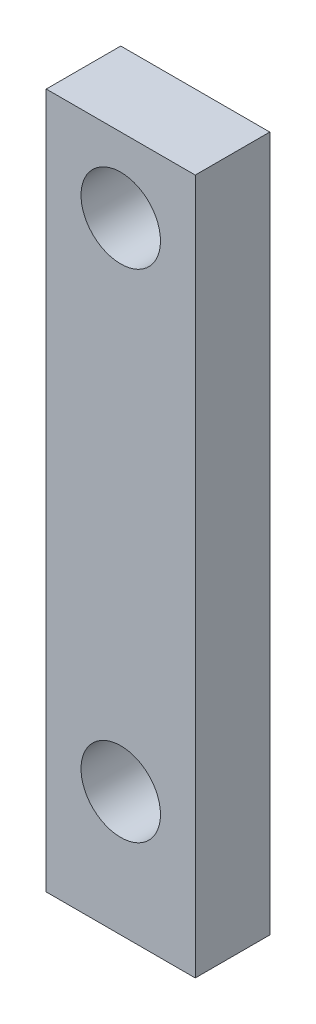
ISO-10303-21;
HEADER;
FILE_DESCRIPTION(('STEP AP214'),'2;1');
FILE_NAME('part.step','',(''),(''),'','','');
FILE_SCHEMA(('AUTOMOTIVE_DESIGN { 1 0 10303 214 1 1 1 1 }'));
ENDSEC;
DATA;
#1=APPLICATION_CONTEXT('core data for automotive mechanical design processes');
#2=APPLICATION_PROTOCOL_DEFINITION('international standard','automotive_design',2000,#1);
#3=PRODUCT_CONTEXT('',#1,'mechanical');
#4=PRODUCT('Part','Part','',(#3));
#5=PRODUCT_RELATED_PRODUCT_CATEGORY('part','',(#4));
#6=PRODUCT_DEFINITION_FORMATION('','',#4);
#7=PRODUCT_DEFINITION_CONTEXT('part definition',#1,'design');
#8=PRODUCT_DEFINITION('design','',#6,#7);
#9=PRODUCT_DEFINITION_SHAPE('','',#8);
#10=(LENGTH_UNIT() NAMED_UNIT(*) SI_UNIT(.MILLI.,.METRE.));
#11=(NAMED_UNIT(*) PLANE_ANGLE_UNIT() SI_UNIT($,.RADIAN.));
#12=(NAMED_UNIT(*) SI_UNIT($,.STERADIAN.) SOLID_ANGLE_UNIT());
#13=UNCERTAINTY_MEASURE_WITH_UNIT(LENGTH_MEASURE(1.E-05),#10,'distance_accuracy_value','');
#14=(GEOMETRIC_REPRESENTATION_CONTEXT(3) GLOBAL_UNCERTAINTY_ASSIGNED_CONTEXT((#13)) GLOBAL_UNIT_ASSIGNED_CONTEXT((#10,
#11,#12)) REPRESENTATION_CONTEXT('',''));
#15=CARTESIAN_POINT('',(0.,0.,0.));
#16=DIRECTION('',(0.,0.,1.));
#17=DIRECTION('',(1.,0.,0.));
#18=AXIS2_PLACEMENT_3D('',#15,#16,#17);
#19=CARTESIAN_POINT('',(0.,0.,3.));
#20=DIRECTION('',(0.,0.,1.));
#21=DIRECTION('',(1.,0.,0.));
#22=AXIS2_PLACEMENT_3D('',#19,#20,#21);
#23=PLANE('',#22);
#24=CARTESIAN_POINT('',(-7.52428779759909,59.3000000000002,3.));
#25=DIRECTION('',(0.,0.,1.));
#26=DIRECTION('',(1.,0.,0.));
#27=AXIS2_PLACEMENT_3D('',#24,#25,#26);
#28=CIRCLE('',#27,1.6);
#29=CARTESIAN_POINT('',(-5.92428779759909,59.3000000000002,3.));
#30=VERTEX_POINT('',#29);
#31=EDGE_CURVE('E99',#30,#30,#28,.T.);
#32=ORIENTED_EDGE('',*,*,#31,.F.);
#33=EDGE_LOOP('',(#32));
#34=FACE_BOUND('',#33,.T.);
#35=DIRECTION('',(0.,1.,0.));
#36=VECTOR('',#35,1.);
#37=CARTESIAN_POINT('',(-4.52428779759909,54.3000000000002,3.));
#38=LINE('',#37,#36);
#39=CARTESIAN_POINT('',(-4.52428779759909,54.3000000000002,3.));
#40=VERTEX_POINT('',#39);
#41=CARTESIAN_POINT('',(-4.52428779759909,82.3000000000003,3.));
#42=VERTEX_POINT('',#41);
#43=EDGE_CURVE('E84',#40,#42,#38,.T.);
#44=ORIENTED_EDGE('',*,*,#43,.T.);
#45=DIRECTION('',(-1.,0.,0.));
#46=VECTOR('',#45,1.);
#47=CARTESIAN_POINT('',(-4.52428779759909,82.3000000000003,3.));
#48=LINE('',#47,#46);
#49=CARTESIAN_POINT('',(-10.5242877975991,82.3000000000003,3.));
#50=VERTEX_POINT('',#49);
#51=EDGE_CURVE('E79',#42,#50,#48,.T.);
#52=ORIENTED_EDGE('',*,*,#51,.T.);
#53=DIRECTION('',(0.,-1.,0.));
#54=VECTOR('',#53,1.);
#55=CARTESIAN_POINT('',(-10.5242877975991,54.3000000000002,3.));
#56=LINE('',#55,#54);
#57=CARTESIAN_POINT('',(-10.5242877975991,54.3000000000002,3.));
#58=VERTEX_POINT('',#57);
#59=EDGE_CURVE('E82',#50,#58,#56,.T.);
#60=ORIENTED_EDGE('',*,*,#59,.T.);
#61=DIRECTION('',(1.,0.,0.));
#62=VECTOR('',#61,1.);
#63=CARTESIAN_POINT('',(-4.52428779759909,54.3000000000002,3.));
#64=LINE('',#63,#62);
#65=EDGE_CURVE('E49',#58,#40,#64,.T.);
#66=ORIENTED_EDGE('',*,*,#65,.T.);
#67=EDGE_LOOP('',(#44,#52,#60,#66));
#68=FACE_BOUND('',#67,.T.);
#69=CARTESIAN_POINT('',(-7.52428779759909,79.3000000000002,3.));
#70=DIRECTION('',(0.,0.,1.));
#71=DIRECTION('',(1.,0.,0.));
#72=AXIS2_PLACEMENT_3D('',#69,#70,#71);
#73=CIRCLE('',#72,1.60000000000001);
#74=CARTESIAN_POINT('',(-5.92428779759909,79.3000000000002,3.));
#75=VERTEX_POINT('',#74);
#76=EDGE_CURVE('E114',#75,#75,#73,.T.);
#77=ORIENTED_EDGE('',*,*,#76,.F.);
#78=EDGE_LOOP('',(#77));
#79=FACE_BOUND('',#78,.T.);
#80=ADVANCED_FACE('F32',(#34,#68,#79),#23,.T.);
#81=CARTESIAN_POINT('',(0.,0.,0.));
#82=DIRECTION('',(0.,0.,1.));
#83=DIRECTION('',(1.,0.,0.));
#84=AXIS2_PLACEMENT_3D('',#81,#82,#83);
#85=PLANE('',#84);
#86=DIRECTION('',(0.,1.,0.));
#87=VECTOR('',#86,1.);
#88=CARTESIAN_POINT('',(-4.52428779759909,54.3000000000002,0.));
#89=LINE('',#88,#87);
#90=CARTESIAN_POINT('',(-4.52428779759909,54.3000000000002,0.));
#91=VERTEX_POINT('',#90);
#92=CARTESIAN_POINT('',(-4.52428779759909,82.3000000000003,0.));
#93=VERTEX_POINT('',#92);
#94=EDGE_CURVE('E96',#91,#93,#89,.T.);
#95=ORIENTED_EDGE('',*,*,#94,.F.);
#96=DIRECTION('',(1.,0.,0.));
#97=VECTOR('',#96,1.);
#98=CARTESIAN_POINT('',(-4.52428779759909,54.3000000000002,0.));
#99=LINE('',#98,#97);
#100=CARTESIAN_POINT('',(-10.5242877975991,54.3000000000002,0.));
#101=VERTEX_POINT('',#100);
#102=EDGE_CURVE('E72',#101,#91,#99,.T.);
#103=ORIENTED_EDGE('',*,*,#102,.F.);
#104=DIRECTION('',(0.,-1.,0.));
#105=VECTOR('',#104,1.);
#106=CARTESIAN_POINT('',(-10.5242877975991,54.3000000000002,0.));
#107=LINE('',#106,#105);
#108=CARTESIAN_POINT('',(-10.5242877975991,82.3000000000003,0.));
#109=VERTEX_POINT('',#108);
#110=EDGE_CURVE('E66',#109,#101,#107,.T.);
#111=ORIENTED_EDGE('',*,*,#110,.F.);
#112=DIRECTION('',(-1.,0.,0.));
#113=VECTOR('',#112,1.);
#114=CARTESIAN_POINT('',(-4.52428779759909,82.3000000000003,0.));
#115=LINE('',#114,#113);
#116=EDGE_CURVE('E88',#93,#109,#115,.T.);
#117=ORIENTED_EDGE('',*,*,#116,.F.);
#118=EDGE_LOOP('',(#95,#103,#111,#117));
#119=FACE_BOUND('',#118,.T.);
#120=CARTESIAN_POINT('',(-7.52428779759909,59.3000000000002,0.));
#121=DIRECTION('',(0.,0.,1.));
#122=DIRECTION('',(1.,0.,0.));
#123=AXIS2_PLACEMENT_3D('',#120,#121,#122);
#124=CIRCLE('',#123,1.6);
#125=CARTESIAN_POINT('',(-5.92428779759909,59.3000000000002,0.));
#126=VERTEX_POINT('',#125);
#127=EDGE_CURVE('E111',#126,#126,#124,.T.);
#128=ORIENTED_EDGE('',*,*,#127,.T.);
#129=EDGE_LOOP('',(#128));
#130=FACE_BOUND('',#129,.T.);
#131=CARTESIAN_POINT('',(-7.52428779759909,79.3000000000002,0.));
#132=DIRECTION('',(0.,0.,1.));
#133=DIRECTION('',(1.,0.,0.));
#134=AXIS2_PLACEMENT_3D('',#131,#132,#133);
#135=CIRCLE('',#134,1.60000000000001);
#136=CARTESIAN_POINT('',(-5.92428779759909,79.3000000000002,0.));
#137=VERTEX_POINT('',#136);
#138=EDGE_CURVE('E117',#137,#137,#135,.T.);
#139=ORIENTED_EDGE('',*,*,#138,.T.);
#140=EDGE_LOOP('',(#139));
#141=FACE_BOUND('',#140,.T.);
#142=ADVANCED_FACE('F107',(#119,#130,#141),#85,.F.);
#143=CARTESIAN_POINT('',(-4.52428779759909,54.3000000000002,3.));
#144=DIRECTION('',(-1.,0.,0.));
#145=DIRECTION('',(0.,0.,1.));
#146=AXIS2_PLACEMENT_3D('',#143,#144,#145);
#147=PLANE('',#146);
#148=ORIENTED_EDGE('',*,*,#94,.T.);
#149=DIRECTION('',(0.,0.,-1.));
#150=VECTOR('',#149,1.);
#151=CARTESIAN_POINT('',(-4.52428779759909,82.3000000000003,3.));
#152=LINE('',#151,#150);
#153=EDGE_CURVE('E11',#42,#93,#152,.T.);
#154=ORIENTED_EDGE('',*,*,#153,.F.);
#155=ORIENTED_EDGE('',*,*,#43,.F.);
#156=DIRECTION('',(0.,0.,-1.));
#157=VECTOR('',#156,1.);
#158=CARTESIAN_POINT('',(-4.52428779759909,54.3000000000002,3.));
#159=LINE('',#158,#157);
#160=EDGE_CURVE('E92',#40,#91,#159,.T.);
#161=ORIENTED_EDGE('',*,*,#160,.T.);
#162=EDGE_LOOP('',(#148,#154,#155,#161));
#163=FACE_BOUND('',#162,.T.);
#164=ADVANCED_FACE('F34',(#163),#147,.F.);
#165=CARTESIAN_POINT('',(-4.52428779759909,82.3000000000003,3.));
#166=DIRECTION('',(0.,-1.,0.));
#167=DIRECTION('',(0.,0.,-1.));
#168=AXIS2_PLACEMENT_3D('',#165,#166,#167);
#169=PLANE('',#168);
#170=ORIENTED_EDGE('',*,*,#116,.T.);
#171=DIRECTION('',(0.,0.,-1.));
#172=VECTOR('',#171,1.);
#173=CARTESIAN_POINT('',(-10.5242877975991,82.3000000000003,3.));
#174=LINE('',#173,#172);
#175=EDGE_CURVE('E41',#50,#109,#174,.T.);
#176=ORIENTED_EDGE('',*,*,#175,.F.);
#177=ORIENTED_EDGE('',*,*,#51,.F.);
#178=ORIENTED_EDGE('',*,*,#153,.T.);
#179=EDGE_LOOP('',(#170,#176,#177,#178));
#180=FACE_BOUND('',#179,.T.);
#181=ADVANCED_FACE('F87',(#180),#169,.F.);
#182=CARTESIAN_POINT('',(-10.5242877975991,54.3000000000002,3.));
#183=DIRECTION('',(1.,0.,0.));
#184=DIRECTION('',(0.,0.,-1.));
#185=AXIS2_PLACEMENT_3D('',#182,#183,#184);
#186=PLANE('',#185);
#187=ORIENTED_EDGE('',*,*,#110,.T.);
#188=DIRECTION('',(0.,0.,-1.));
#189=VECTOR('',#188,1.);
#190=CARTESIAN_POINT('',(-10.5242877975991,54.3000000000002,3.));
#191=LINE('',#190,#189);
#192=EDGE_CURVE('E89',#58,#101,#191,.T.);
#193=ORIENTED_EDGE('',*,*,#192,.F.);
#194=ORIENTED_EDGE('',*,*,#59,.F.);
#195=ORIENTED_EDGE('',*,*,#175,.T.);
#196=EDGE_LOOP('',(#187,#193,#194,#195));
#197=FACE_BOUND('',#196,.T.);
#198=ADVANCED_FACE('F90',(#197),#186,.F.);
#199=CARTESIAN_POINT('',(-4.52428779759909,54.3000000000002,3.));
#200=DIRECTION('',(0.,1.,0.));
#201=DIRECTION('',(0.,0.,1.));
#202=AXIS2_PLACEMENT_3D('',#199,#200,#201);
#203=PLANE('',#202);
#204=ORIENTED_EDGE('',*,*,#102,.T.);
#205=ORIENTED_EDGE('',*,*,#160,.F.);
#206=ORIENTED_EDGE('',*,*,#65,.F.);
#207=ORIENTED_EDGE('',*,*,#192,.T.);
#208=EDGE_LOOP('',(#204,#205,#206,#207));
#209=FACE_BOUND('',#208,.T.);
#210=ADVANCED_FACE('F104',(#209),#203,.F.);
#211=CARTESIAN_POINT('',(-7.52428779759909,59.3000000000002,3.));
#212=DIRECTION('',(0.,0.,-1.));
#213=DIRECTION('',(-1.,0.,0.));
#214=AXIS2_PLACEMENT_3D('',#211,#212,#213);
#215=CYLINDRICAL_SURFACE('',#214,1.6);
#216=ORIENTED_EDGE('',*,*,#31,.T.);
#217=EDGE_LOOP('',(#216));
#218=FACE_BOUND('',#217,.T.);
#219=ORIENTED_EDGE('',*,*,#127,.F.);
#220=EDGE_LOOP('',(#219));
#221=FACE_BOUND('',#220,.T.);
#222=ADVANCED_FACE('F134',(#218,#221),#215,.F.);
#223=CARTESIAN_POINT('',(-7.52428779759909,79.3000000000002,3.));
#224=DIRECTION('',(0.,0.,-1.));
#225=DIRECTION('',(-1.,0.,0.));
#226=AXIS2_PLACEMENT_3D('',#223,#224,#225);
#227=CYLINDRICAL_SURFACE('',#226,1.60000000000001);
#228=ORIENTED_EDGE('',*,*,#76,.T.);
#229=EDGE_LOOP('',(#228));
#230=FACE_BOUND('',#229,.T.);
#231=ORIENTED_EDGE('',*,*,#138,.F.);
#232=EDGE_LOOP('',(#231));
#233=FACE_BOUND('',#232,.T.);
#234=ADVANCED_FACE('F123',(#230,#233),#227,.F.);
#235=CLOSED_SHELL('',(#80,#142,#164,#181,#198,#210,#222,#234));
#236=MANIFOLD_SOLID_BREP('B2',#235);
#237=ADVANCED_BREP_SHAPE_REPRESENTATION('',(#18,#236),#14);
#238=SHAPE_DEFINITION_REPRESENTATION(#9,#237);
ENDSEC;
END-ISO-10303-21;
